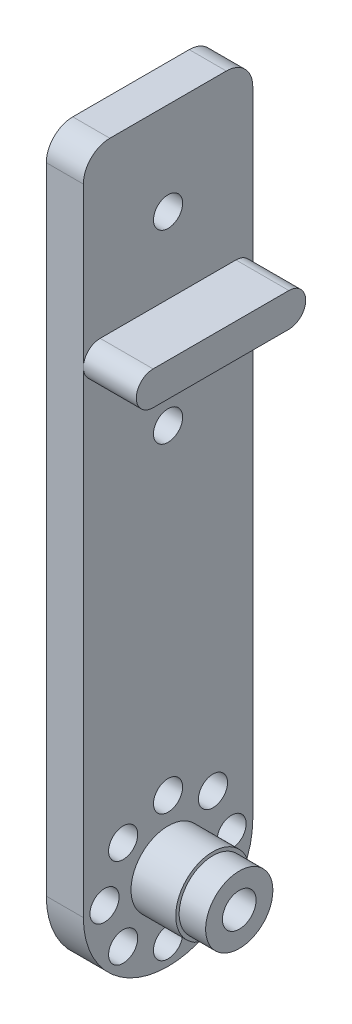
ISO-10303-21;
HEADER;
FILE_DESCRIPTION(('STEP AP214'),'2;1');
FILE_NAME('part.step','',(''),(''),'','','');
FILE_SCHEMA(('AUTOMOTIVE_DESIGN { 1 0 10303 214 1 1 1 1 }'));
ENDSEC;
DATA;
#1=APPLICATION_CONTEXT('core data for automotive mechanical design processes');
#2=APPLICATION_PROTOCOL_DEFINITION('international standard','automotive_design',2000,#1);
#3=PRODUCT_CONTEXT('',#1,'mechanical');
#4=PRODUCT('Part','Part','',(#3));
#5=PRODUCT_RELATED_PRODUCT_CATEGORY('part','',(#4));
#6=PRODUCT_DEFINITION_FORMATION('','',#4);
#7=PRODUCT_DEFINITION_CONTEXT('part definition',#1,'design');
#8=PRODUCT_DEFINITION('design','',#6,#7);
#9=PRODUCT_DEFINITION_SHAPE('','',#8);
#10=(LENGTH_UNIT() NAMED_UNIT(*) SI_UNIT(.MILLI.,.METRE.));
#11=(NAMED_UNIT(*) PLANE_ANGLE_UNIT() SI_UNIT($,.RADIAN.));
#12=(NAMED_UNIT(*) SI_UNIT($,.STERADIAN.) SOLID_ANGLE_UNIT());
#13=UNCERTAINTY_MEASURE_WITH_UNIT(LENGTH_MEASURE(1.E-05),#10,'distance_accuracy_value','');
#14=(GEOMETRIC_REPRESENTATION_CONTEXT(3) GLOBAL_UNCERTAINTY_ASSIGNED_CONTEXT((#13)) GLOBAL_UNIT_ASSIGNED_CONTEXT((#10,
#11,#12)) REPRESENTATION_CONTEXT('',''));
#15=CARTESIAN_POINT('',(0.,0.,0.));
#16=DIRECTION('',(0.,0.,1.));
#17=DIRECTION('',(1.,0.,0.));
#18=AXIS2_PLACEMENT_3D('',#15,#16,#17);
#19=CARTESIAN_POINT('',(7.,0.,0.));
#20=DIRECTION('',(1.,0.,0.));
#21=DIRECTION('',(0.,0.,-1.));
#22=AXIS2_PLACEMENT_3D('',#19,#20,#21);
#23=PLANE('',#22);
#24=CARTESIAN_POINT('',(7.,0.,0.));
#25=DIRECTION('',(1.,0.,0.));
#26=DIRECTION('',(0.,0.,-1.));
#27=AXIS2_PLACEMENT_3D('',#24,#25,#26);
#28=CIRCLE('',#27,7.);
#29=CARTESIAN_POINT('',(7.,0.,-7.));
#30=VERTEX_POINT('',#29);
#31=EDGE_CURVE('E277',#30,#30,#28,.T.);
#32=ORIENTED_EDGE('',*,*,#31,.F.);
#33=EDGE_LOOP('',(#32));
#34=FACE_BOUND('',#33,.T.);
#35=CARTESIAN_POINT('',(7.,0.,12.));
#36=DIRECTION('',(1.,0.,0.));
#37=DIRECTION('',(0.,0.,-1.));
#38=AXIS2_PLACEMENT_3D('',#35,#36,#37);
#39=CIRCLE('',#38,2.75);
#40=CARTESIAN_POINT('',(7.,0.,9.25));
#41=VERTEX_POINT('',#40);
#42=EDGE_CURVE('E291',#41,#41,#39,.T.);
#43=ORIENTED_EDGE('',*,*,#42,.F.);
#44=EDGE_LOOP('',(#43));
#45=FACE_BOUND('',#44,.T.);
#46=CARTESIAN_POINT('',(7.,-12.,0.));
#47=DIRECTION('',(1.,0.,0.));
#48=DIRECTION('',(0.,0.,-1.));
#49=AXIS2_PLACEMENT_3D('',#46,#47,#48);
#50=CIRCLE('',#49,2.75);
#51=CARTESIAN_POINT('',(7.,-12.,-2.75));
#52=VERTEX_POINT('',#51);
#53=EDGE_CURVE('E303',#52,#52,#50,.T.);
#54=ORIENTED_EDGE('',*,*,#53,.F.);
#55=EDGE_LOOP('',(#54));
#56=FACE_BOUND('',#55,.T.);
#57=CARTESIAN_POINT('',(7.,0.,-12.));
#58=DIRECTION('',(1.,0.,0.));
#59=DIRECTION('',(0.,0.,-1.));
#60=AXIS2_PLACEMENT_3D('',#57,#58,#59);
#61=CIRCLE('',#60,2.75);
#62=CARTESIAN_POINT('',(7.,0.,-14.75));
#63=VERTEX_POINT('',#62);
#64=EDGE_CURVE('E315',#63,#63,#61,.T.);
#65=ORIENTED_EDGE('',*,*,#64,.F.);
#66=EDGE_LOOP('',(#65));
#67=FACE_BOUND('',#66,.T.);
#68=CARTESIAN_POINT('',(7.,12.,0.));
#69=DIRECTION('',(1.,0.,0.));
#70=DIRECTION('',(0.,0.,-1.));
#71=AXIS2_PLACEMENT_3D('',#68,#69,#70);
#72=CIRCLE('',#71,2.75);
#73=CARTESIAN_POINT('',(7.,12.,-2.75));
#74=VERTEX_POINT('',#73);
#75=EDGE_CURVE('E327',#74,#74,#72,.T.);
#76=ORIENTED_EDGE('',*,*,#75,.F.);
#77=EDGE_LOOP('',(#76));
#78=FACE_BOUND('',#77,.T.);
#79=CARTESIAN_POINT('',(7.,72.5,0.));
#80=DIRECTION('',(1.,0.,0.));
#81=DIRECTION('',(0.,0.,-1.));
#82=AXIS2_PLACEMENT_3D('',#79,#80,#81);
#83=CIRCLE('',#82,2.75);
#84=CARTESIAN_POINT('',(7.,72.5,-2.75));
#85=VERTEX_POINT('',#84);
#86=EDGE_CURVE('E198',#85,#85,#83,.T.);
#87=ORIENTED_EDGE('',*,*,#86,.F.);
#88=EDGE_LOOP('',(#87));
#89=FACE_BOUND('',#88,.T.);
#90=CARTESIAN_POINT('',(7.,8.48528137423857,-8.48528137423857));
#91=DIRECTION('',(1.,0.,0.));
#92=DIRECTION('',(0.,0.,-1.));
#93=AXIS2_PLACEMENT_3D('',#90,#91,#92);
#94=CIRCLE('',#93,2.75);
#95=CARTESIAN_POINT('',(7.,8.48528137423857,-11.2352813742386));
#96=VERTEX_POINT('',#95);
#97=EDGE_CURVE('E321',#96,#96,#94,.T.);
#98=ORIENTED_EDGE('',*,*,#97,.F.);
#99=EDGE_LOOP('',(#98));
#100=FACE_BOUND('',#99,.T.);
#101=CARTESIAN_POINT('',(7.,-8.48528137423857,-8.48528137423857));
#102=DIRECTION('',(1.,0.,0.));
#103=DIRECTION('',(0.,0.,-1.));
#104=AXIS2_PLACEMENT_3D('',#101,#102,#103);
#105=CIRCLE('',#104,2.75);
#106=CARTESIAN_POINT('',(7.,-8.48528137423857,-11.2352813742386));
#107=VERTEX_POINT('',#106);
#108=EDGE_CURVE('E309',#107,#107,#105,.T.);
#109=ORIENTED_EDGE('',*,*,#108,.F.);
#110=EDGE_LOOP('',(#109));
#111=FACE_BOUND('',#110,.T.);
#112=CARTESIAN_POINT('',(7.,-8.48528137423857,8.48528137423857));
#113=DIRECTION('',(1.,0.,0.));
#114=DIRECTION('',(0.,0.,-1.));
#115=AXIS2_PLACEMENT_3D('',#112,#113,#114);
#116=CIRCLE('',#115,2.75);
#117=CARTESIAN_POINT('',(7.,-8.48528137423857,5.73528137423857));
#118=VERTEX_POINT('',#117);
#119=EDGE_CURVE('E297',#118,#118,#116,.T.);
#120=ORIENTED_EDGE('',*,*,#119,.F.);
#121=EDGE_LOOP('',(#120));
#122=FACE_BOUND('',#121,.T.);
#123=CARTESIAN_POINT('',(7.,8.48528137423857,8.48528137423857));
#124=DIRECTION('',(1.,0.,0.));
#125=DIRECTION('',(0.,0.,-1.));
#126=AXIS2_PLACEMENT_3D('',#123,#124,#125);
#127=CIRCLE('',#126,2.75);
#128=CARTESIAN_POINT('',(7.,8.48528137423857,5.73528137423857));
#129=VERTEX_POINT('',#128);
#130=EDGE_CURVE('E285',#129,#129,#127,.T.);
#131=ORIENTED_EDGE('',*,*,#130,.F.);
#132=EDGE_LOOP('',(#131));
#133=FACE_BOUND('',#132,.T.);
#134=CARTESIAN_POINT('',(7.,90.,-12.825));
#135=DIRECTION('',(1.,0.,0.));
#136=DIRECTION('',(0.,0.,-1.));
#137=AXIS2_PLACEMENT_3D('',#134,#135,#136);
#138=CIRCLE('',#137,3.17500000000001);
#139=CARTESIAN_POINT('',(7.,86.825,-12.825));
#140=VERTEX_POINT('',#139);
#141=CARTESIAN_POINT('',(7.,90.,-16.));
#142=VERTEX_POINT('',#141);
#143=EDGE_CURVE('E584',#140,#142,#138,.T.);
#144=ORIENTED_EDGE('',*,*,#143,.F.);
#145=DIRECTION('',(0.,0.,-1.));
#146=VECTOR('',#145,1.);
#147=CARTESIAN_POINT('',(7.,86.825,12.825));
#148=LINE('',#147,#146);
#149=CARTESIAN_POINT('',(7.,86.825,12.825));
#150=VERTEX_POINT('',#149);
#151=EDGE_CURVE('E585',#150,#140,#148,.T.);
#152=ORIENTED_EDGE('',*,*,#151,.F.);
#153=CARTESIAN_POINT('',(7.,90.,12.825));
#154=DIRECTION('',(1.,0.,0.));
#155=DIRECTION('',(0.,0.,-1.));
#156=AXIS2_PLACEMENT_3D('',#153,#154,#155);
#157=CIRCLE('',#156,3.17500000000001);
#158=CARTESIAN_POINT('',(7.,90.,16.));
#159=VERTEX_POINT('',#158);
#160=EDGE_CURVE('E267',#159,#150,#157,.T.);
#161=ORIENTED_EDGE('',*,*,#160,.F.);
#162=DIRECTION('',(0.,-1.,0.));
#163=VECTOR('',#162,1.);
#164=CARTESIAN_POINT('',(7.,119.999999999996,16.));
#165=LINE('',#164,#163);
#166=CARTESIAN_POINT('',(7.,0.,16.));
#167=VERTEX_POINT('',#166);
#168=EDGE_CURVE('E63',#159,#167,#165,.T.);
#169=ORIENTED_EDGE('',*,*,#168,.T.);
#170=CARTESIAN_POINT('',(7.,0.,0.));
#171=DIRECTION('',(1.,0.,0.));
#172=DIRECTION('',(0.,0.,-1.));
#173=AXIS2_PLACEMENT_3D('',#170,#171,#172);
#174=CIRCLE('',#173,16.);
#175=CARTESIAN_POINT('',(7.,0.,-16.));
#176=VERTEX_POINT('',#175);
#177=EDGE_CURVE('E154',#167,#176,#174,.T.);
#178=ORIENTED_EDGE('',*,*,#177,.T.);
#179=DIRECTION('',(0.,1.,0.));
#180=VECTOR('',#179,1.);
#181=CARTESIAN_POINT('',(7.,119.999999999996,-16.));
#182=LINE('',#181,#180);
#183=EDGE_CURVE('E100',#176,#142,#182,.T.);
#184=ORIENTED_EDGE('',*,*,#183,.T.);
#185=EDGE_LOOP('',(#144,#152,#161,#169,#178,#184));
#186=FACE_BOUND('',#185,.T.);
#187=ADVANCED_FACE('F38',(#34,#45,#56,#67,#78,#89,#100,#111,#122,#133,#186),#23,.T.);
#188=CARTESIAN_POINT('',(7.,107.5,0.));
#189=DIRECTION('',(1.,0.,0.));
#190=DIRECTION('',(0.,0.,-1.));
#191=AXIS2_PLACEMENT_3D('',#188,#189,#190);
#192=CIRCLE('',#191,2.7499945);
#193=CARTESIAN_POINT('',(7.,107.5,-2.7499945));
#194=VERTEX_POINT('',#193);
#195=EDGE_CURVE('E146',#194,#194,#192,.T.);
#196=ORIENTED_EDGE('',*,*,#195,.F.);
#197=EDGE_LOOP('',(#196));
#198=FACE_BOUND('',#197,.T.);
#199=CARTESIAN_POINT('',(7.,119.999999999996,16.));
#200=VERTEX_POINT('',#199);
#201=EDGE_CURVE('E137',#200,#159,#165,.T.);
#202=ORIENTED_EDGE('',*,*,#201,.T.);
#203=CARTESIAN_POINT('',(7.,93.175,12.825));
#204=VERTEX_POINT('',#203);
#205=EDGE_CURVE('E222',#204,#159,#157,.T.);
#206=ORIENTED_EDGE('',*,*,#205,.F.);
#207=DIRECTION('',(0.,0.,1.));
#208=VECTOR('',#207,1.);
#209=CARTESIAN_POINT('',(7.,93.175,12.825));
#210=LINE('',#209,#208);
#211=CARTESIAN_POINT('',(7.,93.175,-12.825));
#212=VERTEX_POINT('',#211);
#213=EDGE_CURVE('E265',#212,#204,#210,.T.);
#214=ORIENTED_EDGE('',*,*,#213,.F.);
#215=EDGE_CURVE('E210',#142,#212,#138,.T.);
#216=ORIENTED_EDGE('',*,*,#215,.F.);
#217=CARTESIAN_POINT('',(7.,119.999999999996,-16.));
#218=VERTEX_POINT('',#217);
#219=EDGE_CURVE('E205',#142,#218,#182,.T.);
#220=ORIENTED_EDGE('',*,*,#219,.T.);
#221=CARTESIAN_POINT('',(7.,120.,-11.));
#222=DIRECTION('',(1.,0.,0.));
#223=DIRECTION('',(0.,0.,-1.));
#224=AXIS2_PLACEMENT_3D('',#221,#222,#223);
#225=CIRCLE('',#224,5.);
#226=CARTESIAN_POINT('',(7.,125.,-11.));
#227=VERTEX_POINT('',#226);
#228=EDGE_CURVE('E119',#218,#227,#225,.T.);
#229=ORIENTED_EDGE('',*,*,#228,.T.);
#230=DIRECTION('',(0.,0.,1.));
#231=VECTOR('',#230,1.);
#232=CARTESIAN_POINT('',(7.,125.,11.));
#233=LINE('',#232,#231);
#234=CARTESIAN_POINT('',(7.,125.,11.));
#235=VERTEX_POINT('',#234);
#236=EDGE_CURVE('E111',#227,#235,#233,.T.);
#237=ORIENTED_EDGE('',*,*,#236,.T.);
#238=CARTESIAN_POINT('',(7.,120.,11.));
#239=DIRECTION('',(1.,0.,0.));
#240=DIRECTION('',(0.,0.,1.));
#241=AXIS2_PLACEMENT_3D('',#238,#239,#240);
#242=CIRCLE('',#241,5.);
#243=EDGE_CURVE('E116',#235,#200,#242,.T.);
#244=ORIENTED_EDGE('',*,*,#243,.T.);
#245=EDGE_LOOP('',(#202,#206,#214,#216,#220,#229,#237,#244));
#246=FACE_BOUND('',#245,.T.);
#247=ADVANCED_FACE('F114',(#198,#246),#23,.T.);
#248=CARTESIAN_POINT('',(0.,0.,0.));
#249=DIRECTION('',(1.,0.,0.));
#250=DIRECTION('',(0.,0.,-1.));
#251=AXIS2_PLACEMENT_3D('',#248,#249,#250);
#252=PLANE('',#251);
#253=CARTESIAN_POINT('',(0.,0.,0.));
#254=DIRECTION('',(1.,0.,0.));
#255=DIRECTION('',(0.,0.,-1.));
#256=AXIS2_PLACEMENT_3D('',#253,#254,#255);
#257=CIRCLE('',#256,16.);
#258=CARTESIAN_POINT('',(0.,0.,16.));
#259=VERTEX_POINT('',#258);
#260=CARTESIAN_POINT('',(0.,0.,-16.));
#261=VERTEX_POINT('',#260);
#262=EDGE_CURVE('E142',#259,#261,#257,.T.);
#263=ORIENTED_EDGE('',*,*,#262,.F.);
#264=DIRECTION('',(0.,-1.,0.));
#265=VECTOR('',#264,1.);
#266=CARTESIAN_POINT('',(0.,119.999999999996,16.));
#267=LINE('',#266,#265);
#268=CARTESIAN_POINT('',(0.,119.999999999996,16.));
#269=VERTEX_POINT('',#268);
#270=EDGE_CURVE('E91',#269,#259,#267,.T.);
#271=ORIENTED_EDGE('',*,*,#270,.F.);
#272=CARTESIAN_POINT('',(0.,120.,11.));
#273=DIRECTION('',(1.,0.,0.));
#274=DIRECTION('',(0.,0.,1.));
#275=AXIS2_PLACEMENT_3D('',#272,#273,#274);
#276=CIRCLE('',#275,5.);
#277=CARTESIAN_POINT('',(0.,125.,11.));
#278=VERTEX_POINT('',#277);
#279=EDGE_CURVE('E151',#278,#269,#276,.T.);
#280=ORIENTED_EDGE('',*,*,#279,.F.);
#281=DIRECTION('',(0.,0.,1.));
#282=VECTOR('',#281,1.);
#283=CARTESIAN_POINT('',(0.,125.,11.));
#284=LINE('',#283,#282);
#285=CARTESIAN_POINT('',(0.,125.,-11.));
#286=VERTEX_POINT('',#285);
#287=EDGE_CURVE('E128',#286,#278,#284,.T.);
#288=ORIENTED_EDGE('',*,*,#287,.F.);
#289=CARTESIAN_POINT('',(0.,120.,-11.));
#290=DIRECTION('',(1.,0.,0.));
#291=DIRECTION('',(0.,0.,-1.));
#292=AXIS2_PLACEMENT_3D('',#289,#290,#291);
#293=CIRCLE('',#292,5.);
#294=CARTESIAN_POINT('',(0.,119.999999999996,-16.));
#295=VERTEX_POINT('',#294);
#296=EDGE_CURVE('E148',#295,#286,#293,.T.);
#297=ORIENTED_EDGE('',*,*,#296,.F.);
#298=DIRECTION('',(0.,1.,0.));
#299=VECTOR('',#298,1.);
#300=CARTESIAN_POINT('',(0.,119.999999999996,-16.));
#301=LINE('',#300,#299);
#302=EDGE_CURVE('E145',#261,#295,#301,.T.);
#303=ORIENTED_EDGE('',*,*,#302,.F.);
#304=EDGE_LOOP('',(#263,#271,#280,#288,#297,#303));
#305=FACE_BOUND('',#304,.T.);
#306=CARTESIAN_POINT('',(0.,107.5,0.));
#307=DIRECTION('',(1.,0.,0.));
#308=DIRECTION('',(0.,0.,-1.));
#309=AXIS2_PLACEMENT_3D('',#306,#307,#308);
#310=CIRCLE('',#309,2.7499945);
#311=CARTESIAN_POINT('',(0.,107.5,-2.7499945));
#312=VERTEX_POINT('',#311);
#313=EDGE_CURVE('E195',#312,#312,#310,.T.);
#314=ORIENTED_EDGE('',*,*,#313,.T.);
#315=EDGE_LOOP('',(#314));
#316=FACE_BOUND('',#315,.T.);
#317=CARTESIAN_POINT('',(0.,72.5,0.));
#318=DIRECTION('',(1.,0.,0.));
#319=DIRECTION('',(0.,0.,-1.));
#320=AXIS2_PLACEMENT_3D('',#317,#318,#319);
#321=CIRCLE('',#320,2.75);
#322=CARTESIAN_POINT('',(0.,72.5,-2.75));
#323=VERTEX_POINT('',#322);
#324=EDGE_CURVE('E201',#323,#323,#321,.T.);
#325=ORIENTED_EDGE('',*,*,#324,.T.);
#326=EDGE_LOOP('',(#325));
#327=FACE_BOUND('',#326,.T.);
#328=CARTESIAN_POINT('',(0.,12.,0.));
#329=DIRECTION('',(1.,0.,0.));
#330=DIRECTION('',(0.,0.,-1.));
#331=AXIS2_PLACEMENT_3D('',#328,#329,#330);
#332=CIRCLE('',#331,2.75);
#333=CARTESIAN_POINT('',(0.,12.,-2.75));
#334=VERTEX_POINT('',#333);
#335=EDGE_CURVE('E324',#334,#334,#332,.T.);
#336=ORIENTED_EDGE('',*,*,#335,.T.);
#337=EDGE_LOOP('',(#336));
#338=FACE_BOUND('',#337,.T.);
#339=CARTESIAN_POINT('',(0.,8.48528137423857,-8.48528137423857));
#340=DIRECTION('',(1.,0.,0.));
#341=DIRECTION('',(0.,0.,-1.));
#342=AXIS2_PLACEMENT_3D('',#339,#340,#341);
#343=CIRCLE('',#342,2.75);
#344=CARTESIAN_POINT('',(0.,8.48528137423857,-11.2352813742386));
#345=VERTEX_POINT('',#344);
#346=EDGE_CURVE('E318',#345,#345,#343,.T.);
#347=ORIENTED_EDGE('',*,*,#346,.T.);
#348=EDGE_LOOP('',(#347));
#349=FACE_BOUND('',#348,.T.);
#350=CARTESIAN_POINT('',(0.,0.,-12.));
#351=DIRECTION('',(1.,0.,0.));
#352=DIRECTION('',(0.,0.,-1.));
#353=AXIS2_PLACEMENT_3D('',#350,#351,#352);
#354=CIRCLE('',#353,2.75);
#355=CARTESIAN_POINT('',(0.,0.,-14.75));
#356=VERTEX_POINT('',#355);
#357=EDGE_CURVE('E312',#356,#356,#354,.T.);
#358=ORIENTED_EDGE('',*,*,#357,.T.);
#359=EDGE_LOOP('',(#358));
#360=FACE_BOUND('',#359,.T.);
#361=CARTESIAN_POINT('',(0.,-8.48528137423857,-8.48528137423857));
#362=DIRECTION('',(1.,0.,0.));
#363=DIRECTION('',(0.,0.,-1.));
#364=AXIS2_PLACEMENT_3D('',#361,#362,#363);
#365=CIRCLE('',#364,2.75);
#366=CARTESIAN_POINT('',(0.,-8.48528137423857,-11.2352813742386));
#367=VERTEX_POINT('',#366);
#368=EDGE_CURVE('E306',#367,#367,#365,.T.);
#369=ORIENTED_EDGE('',*,*,#368,.T.);
#370=EDGE_LOOP('',(#369));
#371=FACE_BOUND('',#370,.T.);
#372=CARTESIAN_POINT('',(0.,-12.,0.));
#373=DIRECTION('',(1.,0.,0.));
#374=DIRECTION('',(0.,0.,-1.));
#375=AXIS2_PLACEMENT_3D('',#372,#373,#374);
#376=CIRCLE('',#375,2.75);
#377=CARTESIAN_POINT('',(0.,-12.,-2.75));
#378=VERTEX_POINT('',#377);
#379=EDGE_CURVE('E300',#378,#378,#376,.T.);
#380=ORIENTED_EDGE('',*,*,#379,.T.);
#381=EDGE_LOOP('',(#380));
#382=FACE_BOUND('',#381,.T.);
#383=CARTESIAN_POINT('',(0.,-8.48528137423857,8.48528137423857));
#384=DIRECTION('',(1.,0.,0.));
#385=DIRECTION('',(0.,0.,-1.));
#386=AXIS2_PLACEMENT_3D('',#383,#384,#385);
#387=CIRCLE('',#386,2.75);
#388=CARTESIAN_POINT('',(0.,-8.48528137423857,5.73528137423857));
#389=VERTEX_POINT('',#388);
#390=EDGE_CURVE('E294',#389,#389,#387,.T.);
#391=ORIENTED_EDGE('',*,*,#390,.T.);
#392=EDGE_LOOP('',(#391));
#393=FACE_BOUND('',#392,.T.);
#394=CARTESIAN_POINT('',(0.,0.,12.));
#395=DIRECTION('',(1.,0.,0.));
#396=DIRECTION('',(0.,0.,-1.));
#397=AXIS2_PLACEMENT_3D('',#394,#395,#396);
#398=CIRCLE('',#397,2.75);
#399=CARTESIAN_POINT('',(0.,0.,9.25));
#400=VERTEX_POINT('',#399);
#401=EDGE_CURVE('E288',#400,#400,#398,.T.);
#402=ORIENTED_EDGE('',*,*,#401,.T.);
#403=EDGE_LOOP('',(#402));
#404=FACE_BOUND('',#403,.T.);
#405=CARTESIAN_POINT('',(0.,8.48528137423857,8.48528137423857));
#406=DIRECTION('',(1.,0.,0.));
#407=DIRECTION('',(0.,0.,-1.));
#408=AXIS2_PLACEMENT_3D('',#405,#406,#407);
#409=CIRCLE('',#408,2.75);
#410=CARTESIAN_POINT('',(0.,8.48528137423857,5.73528137423857));
#411=VERTEX_POINT('',#410);
#412=EDGE_CURVE('E282',#411,#411,#409,.T.);
#413=ORIENTED_EDGE('',*,*,#412,.T.);
#414=EDGE_LOOP('',(#413));
#415=FACE_BOUND('',#414,.T.);
#416=ADVANCED_FACE('F186',(#305,#316,#327,#338,#349,#360,#371,#382,#393,#404,#415),#252,.F.);
#417=CARTESIAN_POINT('',(7.,0.,0.));
#418=DIRECTION('',(-1.,0.,0.));
#419=DIRECTION('',(0.,0.,1.));
#420=AXIS2_PLACEMENT_3D('',#417,#418,#419);
#421=CYLINDRICAL_SURFACE('',#420,16.);
#422=ORIENTED_EDGE('',*,*,#262,.T.);
#423=DIRECTION('',(-1.,0.,0.));
#424=VECTOR('',#423,1.);
#425=CARTESIAN_POINT('',(7.,0.,-16.));
#426=LINE('',#425,#424);
#427=EDGE_CURVE('E160',#176,#261,#426,.T.);
#428=ORIENTED_EDGE('',*,*,#427,.F.);
#429=ORIENTED_EDGE('',*,*,#177,.F.);
#430=DIRECTION('',(-1.,0.,0.));
#431=VECTOR('',#430,1.);
#432=CARTESIAN_POINT('',(7.,0.,16.));
#433=LINE('',#432,#431);
#434=EDGE_CURVE('E141',#167,#259,#433,.T.);
#435=ORIENTED_EDGE('',*,*,#434,.T.);
#436=EDGE_LOOP('',(#422,#428,#429,#435));
#437=FACE_BOUND('',#436,.T.);
#438=ADVANCED_FACE('F40',(#437),#421,.T.);
#439=CARTESIAN_POINT('',(7.,119.999999999996,-16.));
#440=DIRECTION('',(0.,0.,1.));
#441=DIRECTION('',(1.,0.,0.));
#442=AXIS2_PLACEMENT_3D('',#439,#440,#441);
#443=PLANE('',#442);
#444=ORIENTED_EDGE('',*,*,#302,.T.);
#445=DIRECTION('',(-1.,0.,0.));
#446=VECTOR('',#445,1.);
#447=CARTESIAN_POINT('',(7.,119.999999999996,-16.));
#448=LINE('',#447,#446);
#449=EDGE_CURVE('E158',#218,#295,#448,.T.);
#450=ORIENTED_EDGE('',*,*,#449,.F.);
#451=ORIENTED_EDGE('',*,*,#219,.F.);
#452=ORIENTED_EDGE('',*,*,#183,.F.);
#453=ORIENTED_EDGE('',*,*,#427,.T.);
#454=EDGE_LOOP('',(#444,#450,#451,#452,#453));
#455=FACE_BOUND('',#454,.T.);
#456=ADVANCED_FACE('F211',(#455),#443,.F.);
#457=CARTESIAN_POINT('',(7.,120.,-11.));
#458=DIRECTION('',(-1.,0.,0.));
#459=DIRECTION('',(0.,0.,1.));
#460=AXIS2_PLACEMENT_3D('',#457,#458,#459);
#461=CYLINDRICAL_SURFACE('',#460,5.);
#462=ORIENTED_EDGE('',*,*,#296,.T.);
#463=DIRECTION('',(-1.,0.,0.));
#464=VECTOR('',#463,1.);
#465=CARTESIAN_POINT('',(7.,125.,-11.));
#466=LINE('',#465,#464);
#467=EDGE_CURVE('E131',#227,#286,#466,.T.);
#468=ORIENTED_EDGE('',*,*,#467,.F.);
#469=ORIENTED_EDGE('',*,*,#228,.F.);
#470=ORIENTED_EDGE('',*,*,#449,.T.);
#471=EDGE_LOOP('',(#462,#468,#469,#470));
#472=FACE_BOUND('',#471,.T.);
#473=ADVANCED_FACE('F214',(#472),#461,.T.);
#474=CARTESIAN_POINT('',(7.,125.,11.));
#475=DIRECTION('',(0.,-1.,0.));
#476=DIRECTION('',(0.,0.,-1.));
#477=AXIS2_PLACEMENT_3D('',#474,#475,#476);
#478=PLANE('',#477);
#479=ORIENTED_EDGE('',*,*,#287,.T.);
#480=DIRECTION('',(-1.,0.,0.));
#481=VECTOR('',#480,1.);
#482=CARTESIAN_POINT('',(7.,125.,11.));
#483=LINE('',#482,#481);
#484=EDGE_CURVE('E125',#235,#278,#483,.T.);
#485=ORIENTED_EDGE('',*,*,#484,.F.);
#486=ORIENTED_EDGE('',*,*,#236,.F.);
#487=ORIENTED_EDGE('',*,*,#467,.T.);
#488=EDGE_LOOP('',(#479,#485,#486,#487));
#489=FACE_BOUND('',#488,.T.);
#490=ADVANCED_FACE('F126',(#489),#478,.F.);
#491=CARTESIAN_POINT('',(7.,120.,11.));
#492=DIRECTION('',(-1.,0.,0.));
#493=DIRECTION('',(0.,0.,1.));
#494=AXIS2_PLACEMENT_3D('',#491,#492,#493);
#495=CYLINDRICAL_SURFACE('',#494,5.);
#496=ORIENTED_EDGE('',*,*,#279,.T.);
#497=DIRECTION('',(-1.,0.,0.));
#498=VECTOR('',#497,1.);
#499=CARTESIAN_POINT('',(7.,119.999999999996,16.));
#500=LINE('',#499,#498);
#501=EDGE_CURVE('E132',#200,#269,#500,.T.);
#502=ORIENTED_EDGE('',*,*,#501,.F.);
#503=ORIENTED_EDGE('',*,*,#243,.F.);
#504=ORIENTED_EDGE('',*,*,#484,.T.);
#505=EDGE_LOOP('',(#496,#502,#503,#504));
#506=FACE_BOUND('',#505,.T.);
#507=ADVANCED_FACE('F134',(#506),#495,.T.);
#508=CARTESIAN_POINT('',(7.,119.999999999996,16.));
#509=DIRECTION('',(0.,0.,-1.));
#510=DIRECTION('',(-1.,0.,0.));
#511=AXIS2_PLACEMENT_3D('',#508,#509,#510);
#512=PLANE('',#511);
#513=ORIENTED_EDGE('',*,*,#270,.T.);
#514=ORIENTED_EDGE('',*,*,#434,.F.);
#515=ORIENTED_EDGE('',*,*,#168,.F.);
#516=ORIENTED_EDGE('',*,*,#201,.F.);
#517=ORIENTED_EDGE('',*,*,#501,.T.);
#518=EDGE_LOOP('',(#513,#514,#515,#516,#517));
#519=FACE_BOUND('',#518,.T.);
#520=ADVANCED_FACE('F217',(#519),#512,.F.);
#521=CARTESIAN_POINT('',(7.,107.5,0.));
#522=DIRECTION('',(-1.,0.,0.));
#523=DIRECTION('',(0.,0.,1.));
#524=AXIS2_PLACEMENT_3D('',#521,#522,#523);
#525=CYLINDRICAL_SURFACE('',#524,2.7499945);
#526=ORIENTED_EDGE('',*,*,#195,.T.);
#527=EDGE_LOOP('',(#526));
#528=FACE_BOUND('',#527,.T.);
#529=ORIENTED_EDGE('',*,*,#313,.F.);
#530=EDGE_LOOP('',(#529));
#531=FACE_BOUND('',#530,.T.);
#532=ADVANCED_FACE('F342',(#528,#531),#525,.F.);
#533=CARTESIAN_POINT('',(7.,72.5,0.));
#534=DIRECTION('',(-1.,0.,0.));
#535=DIRECTION('',(0.,0.,1.));
#536=AXIS2_PLACEMENT_3D('',#533,#534,#535);
#537=CYLINDRICAL_SURFACE('',#536,2.75);
#538=ORIENTED_EDGE('',*,*,#86,.T.);
#539=EDGE_LOOP('',(#538));
#540=FACE_BOUND('',#539,.T.);
#541=ORIENTED_EDGE('',*,*,#324,.F.);
#542=EDGE_LOOP('',(#541));
#543=FACE_BOUND('',#542,.T.);
#544=ADVANCED_FACE('F339',(#540,#543),#537,.F.);
#545=CARTESIAN_POINT('',(7.,12.,0.));
#546=DIRECTION('',(-1.,0.,0.));
#547=DIRECTION('',(0.,0.,1.));
#548=AXIS2_PLACEMENT_3D('',#545,#546,#547);
#549=CYLINDRICAL_SURFACE('',#548,2.75);
#550=ORIENTED_EDGE('',*,*,#75,.T.);
#551=EDGE_LOOP('',(#550));
#552=FACE_BOUND('',#551,.T.);
#553=ORIENTED_EDGE('',*,*,#335,.F.);
#554=EDGE_LOOP('',(#553));
#555=FACE_BOUND('',#554,.T.);
#556=ADVANCED_FACE('F341',(#552,#555),#549,.F.);
#557=CARTESIAN_POINT('',(7.,8.48528137423857,-8.48528137423857));
#558=DIRECTION('',(-1.,0.,0.));
#559=DIRECTION('',(0.,0.,1.));
#560=AXIS2_PLACEMENT_3D('',#557,#558,#559);
#561=CYLINDRICAL_SURFACE('',#560,2.75);
#562=ORIENTED_EDGE('',*,*,#97,.T.);
#563=EDGE_LOOP('',(#562));
#564=FACE_BOUND('',#563,.T.);
#565=ORIENTED_EDGE('',*,*,#346,.F.);
#566=EDGE_LOOP('',(#565));
#567=FACE_BOUND('',#566,.T.);
#568=ADVANCED_FACE('F348',(#564,#567),#561,.F.);
#569=CARTESIAN_POINT('',(7.,0.,-12.));
#570=DIRECTION('',(-1.,0.,0.));
#571=DIRECTION('',(0.,0.,1.));
#572=AXIS2_PLACEMENT_3D('',#569,#570,#571);
#573=CYLINDRICAL_SURFACE('',#572,2.75);
#574=ORIENTED_EDGE('',*,*,#64,.T.);
#575=EDGE_LOOP('',(#574));
#576=FACE_BOUND('',#575,.T.);
#577=ORIENTED_EDGE('',*,*,#357,.F.);
#578=EDGE_LOOP('',(#577));
#579=FACE_BOUND('',#578,.T.);
#580=ADVANCED_FACE('F354',(#576,#579),#573,.F.);
#581=CARTESIAN_POINT('',(7.,-8.48528137423857,-8.48528137423857));
#582=DIRECTION('',(-1.,0.,0.));
#583=DIRECTION('',(0.,0.,1.));
#584=AXIS2_PLACEMENT_3D('',#581,#582,#583);
#585=CYLINDRICAL_SURFACE('',#584,2.75);
#586=ORIENTED_EDGE('',*,*,#108,.T.);
#587=EDGE_LOOP('',(#586));
#588=FACE_BOUND('',#587,.T.);
#589=ORIENTED_EDGE('',*,*,#368,.F.);
#590=EDGE_LOOP('',(#589));
#591=FACE_BOUND('',#590,.T.);
#592=ADVANCED_FACE('F358',(#588,#591),#585,.F.);
#593=CARTESIAN_POINT('',(7.,-12.,0.));
#594=DIRECTION('',(-1.,0.,0.));
#595=DIRECTION('',(0.,0.,1.));
#596=AXIS2_PLACEMENT_3D('',#593,#594,#595);
#597=CYLINDRICAL_SURFACE('',#596,2.75);
#598=ORIENTED_EDGE('',*,*,#53,.T.);
#599=EDGE_LOOP('',(#598));
#600=FACE_BOUND('',#599,.T.);
#601=ORIENTED_EDGE('',*,*,#379,.F.);
#602=EDGE_LOOP('',(#601));
#603=FACE_BOUND('',#602,.T.);
#604=ADVANCED_FACE('F362',(#600,#603),#597,.F.);
#605=CARTESIAN_POINT('',(7.,-8.48528137423857,8.48528137423857));
#606=DIRECTION('',(-1.,0.,0.));
#607=DIRECTION('',(0.,0.,1.));
#608=AXIS2_PLACEMENT_3D('',#605,#606,#607);
#609=CYLINDRICAL_SURFACE('',#608,2.75);
#610=ORIENTED_EDGE('',*,*,#119,.T.);
#611=EDGE_LOOP('',(#610));
#612=FACE_BOUND('',#611,.T.);
#613=ORIENTED_EDGE('',*,*,#390,.F.);
#614=EDGE_LOOP('',(#613));
#615=FACE_BOUND('',#614,.T.);
#616=ADVANCED_FACE('F366',(#612,#615),#609,.F.);
#617=CARTESIAN_POINT('',(7.,0.,12.));
#618=DIRECTION('',(-1.,0.,0.));
#619=DIRECTION('',(0.,0.,1.));
#620=AXIS2_PLACEMENT_3D('',#617,#618,#619);
#621=CYLINDRICAL_SURFACE('',#620,2.75);
#622=ORIENTED_EDGE('',*,*,#42,.T.);
#623=EDGE_LOOP('',(#622));
#624=FACE_BOUND('',#623,.T.);
#625=ORIENTED_EDGE('',*,*,#401,.F.);
#626=EDGE_LOOP('',(#625));
#627=FACE_BOUND('',#626,.T.);
#628=ADVANCED_FACE('F370',(#624,#627),#621,.F.);
#629=CARTESIAN_POINT('',(7.,8.48528137423857,8.48528137423857));
#630=DIRECTION('',(-1.,0.,0.));
#631=DIRECTION('',(0.,0.,1.));
#632=AXIS2_PLACEMENT_3D('',#629,#630,#631);
#633=CYLINDRICAL_SURFACE('',#632,2.75);
#634=ORIENTED_EDGE('',*,*,#130,.T.);
#635=EDGE_LOOP('',(#634));
#636=FACE_BOUND('',#635,.T.);
#637=ORIENTED_EDGE('',*,*,#412,.F.);
#638=EDGE_LOOP('',(#637));
#639=FACE_BOUND('',#638,.T.);
#640=ADVANCED_FACE('F374',(#636,#639),#633,.F.);
#641=CARTESIAN_POINT('',(15.449,0.,0.));
#642=DIRECTION('',(1.,0.,0.));
#643=DIRECTION('',(0.,0.,-1.));
#644=AXIS2_PLACEMENT_3D('',#641,#642,#643);
#645=PLANE('',#644);
#646=CARTESIAN_POINT('',(15.449,0.,0.));
#647=DIRECTION('',(1.,0.,0.));
#648=DIRECTION('',(0.,0.,-1.));
#649=AXIS2_PLACEMENT_3D('',#646,#647,#648);
#650=CIRCLE('',#649,6.35);
#651=CARTESIAN_POINT('',(15.449,0.,-6.35));
#652=VERTEX_POINT('',#651);
#653=EDGE_CURVE('E11',#652,#652,#650,.T.);
#654=ORIENTED_EDGE('',*,*,#653,.F.);
#655=EDGE_LOOP('',(#654));
#656=FACE_BOUND('',#655,.T.);
#657=CARTESIAN_POINT('',(15.449,0.,0.));
#658=DIRECTION('',(1.,0.,0.));
#659=DIRECTION('',(0.,0.,-1.));
#660=AXIS2_PLACEMENT_3D('',#657,#658,#659);
#661=CIRCLE('',#660,7.);
#662=CARTESIAN_POINT('',(15.449,0.,-7.));
#663=VERTEX_POINT('',#662);
#664=EDGE_CURVE('E279',#663,#663,#661,.T.);
#665=ORIENTED_EDGE('',*,*,#664,.T.);
#666=EDGE_LOOP('',(#665));
#667=FACE_BOUND('',#666,.T.);
#668=ADVANCED_FACE('F378',(#656,#667),#645,.T.);
#669=CARTESIAN_POINT('',(15.449,0.,0.));
#670=DIRECTION('',(-1.,0.,0.));
#671=DIRECTION('',(0.,0.,1.));
#672=AXIS2_PLACEMENT_3D('',#669,#670,#671);
#673=CYLINDRICAL_SURFACE('',#672,7.);
#674=ORIENTED_EDGE('',*,*,#664,.F.);
#675=EDGE_LOOP('',(#674));
#676=FACE_BOUND('',#675,.T.);
#677=ORIENTED_EDGE('',*,*,#31,.T.);
#678=EDGE_LOOP('',(#677));
#679=FACE_BOUND('',#678,.T.);
#680=ADVANCED_FACE('F380',(#676,#679),#673,.T.);
#681=CARTESIAN_POINT('',(20.449,0.,0.));
#682=DIRECTION('',(-1.,0.,0.));
#683=DIRECTION('',(0.,0.,1.));
#684=AXIS2_PLACEMENT_3D('',#681,#682,#683);
#685=CYLINDRICAL_SURFACE('',#684,6.35);
#686=CARTESIAN_POINT('',(20.449,0.,0.));
#687=DIRECTION('',(1.,0.,0.));
#688=DIRECTION('',(0.,0.,-1.));
#689=AXIS2_PLACEMENT_3D('',#686,#687,#688);
#690=CIRCLE('',#689,6.35);
#691=CARTESIAN_POINT('',(20.449,0.,-6.35));
#692=VERTEX_POINT('',#691);
#693=EDGE_CURVE('E271',#692,#692,#690,.T.);
#694=ORIENTED_EDGE('',*,*,#693,.F.);
#695=EDGE_LOOP('',(#694));
#696=FACE_BOUND('',#695,.T.);
#697=ORIENTED_EDGE('',*,*,#653,.T.);
#698=EDGE_LOOP('',(#697));
#699=FACE_BOUND('',#698,.T.);
#700=ADVANCED_FACE('F178',(#696,#699),#685,.T.);
#701=CARTESIAN_POINT('',(20.449,0.,0.));
#702=DIRECTION('',(1.,0.,0.));
#703=DIRECTION('',(0.,0.,-1.));
#704=AXIS2_PLACEMENT_3D('',#701,#702,#703);
#705=PLANE('',#704);
#706=CARTESIAN_POINT('',(20.449,0.,0.));
#707=DIRECTION('',(1.,0.,0.));
#708=DIRECTION('',(0.,0.,-1.));
#709=AXIS2_PLACEMENT_3D('',#706,#707,#708);
#710=CIRCLE('',#709,3.175);
#711=CARTESIAN_POINT('',(20.449,0.,-3.175));
#712=VERTEX_POINT('',#711);
#713=EDGE_CURVE('E268',#712,#712,#710,.F.);
#714=ORIENTED_EDGE('',*,*,#713,.T.);
#715=EDGE_LOOP('',(#714));
#716=FACE_BOUND('',#715,.T.);
#717=ORIENTED_EDGE('',*,*,#693,.T.);
#718=EDGE_LOOP('',(#717));
#719=FACE_BOUND('',#718,.T.);
#720=ADVANCED_FACE('F170',(#716,#719),#705,.T.);
#721=CARTESIAN_POINT('',(7.,0.,0.));
#722=DIRECTION('',(1.,0.,0.));
#723=DIRECTION('',(0.,0.,-1.));
#724=AXIS2_PLACEMENT_3D('',#721,#722,#723);
#725=CIRCLE('',#724,3.175);
#726=CARTESIAN_POINT('',(7.,0.,-3.175));
#727=VERTEX_POINT('',#726);
#728=EDGE_CURVE('E42',#727,#727,#725,.F.);
#729=ORIENTED_EDGE('',*,*,#728,.F.);
#730=EDGE_LOOP('',(#729));
#731=FACE_BOUND('',#730,.T.);
#732=ADVANCED_FACE('F168',(#731),#23,.T.);
#733=CARTESIAN_POINT('',(15.449,0.,0.));
#734=DIRECTION('',(-1.,0.,0.));
#735=DIRECTION('',(0.,0.,1.));
#736=AXIS2_PLACEMENT_3D('',#733,#734,#735);
#737=CYLINDRICAL_SURFACE('',#736,3.175);
#738=ORIENTED_EDGE('',*,*,#728,.T.);
#739=EDGE_LOOP('',(#738));
#740=FACE_BOUND('',#739,.T.);
#741=ORIENTED_EDGE('',*,*,#713,.F.);
#742=EDGE_LOOP('',(#741));
#743=FACE_BOUND('',#742,.T.);
#744=ADVANCED_FACE('F165',(#740,#743),#737,.F.);
#745=CARTESIAN_POINT('',(17.,90.,12.825));
#746=DIRECTION('',(-1.,0.,0.));
#747=DIRECTION('',(0.,0.,1.));
#748=AXIS2_PLACEMENT_3D('',#745,#746,#747);
#749=CYLINDRICAL_SURFACE('',#748,3.17500000000001);
#750=ORIENTED_EDGE('',*,*,#205,.T.);
#751=ORIENTED_EDGE('',*,*,#160,.T.);
#752=DIRECTION('',(-1.,0.,0.));
#753=VECTOR('',#752,1.);
#754=CARTESIAN_POINT('',(17.,86.825,12.825));
#755=LINE('',#754,#753);
#756=CARTESIAN_POINT('',(17.,86.825,12.825));
#757=VERTEX_POINT('',#756);
#758=EDGE_CURVE('E252',#757,#150,#755,.T.);
#759=ORIENTED_EDGE('',*,*,#758,.F.);
#760=CARTESIAN_POINT('',(17.,90.,12.825));
#761=DIRECTION('',(1.,0.,0.));
#762=DIRECTION('',(0.,0.,-1.));
#763=AXIS2_PLACEMENT_3D('',#760,#761,#762);
#764=CIRCLE('',#763,3.17500000000001);
#765=CARTESIAN_POINT('',(17.,93.175,12.825));
#766=VERTEX_POINT('',#765);
#767=EDGE_CURVE('E259',#766,#757,#764,.T.);
#768=ORIENTED_EDGE('',*,*,#767,.F.);
#769=DIRECTION('',(-1.,0.,0.));
#770=VECTOR('',#769,1.);
#771=CARTESIAN_POINT('',(17.,93.175,12.825));
#772=LINE('',#771,#770);
#773=EDGE_CURVE('E591',#766,#204,#772,.T.);
#774=ORIENTED_EDGE('',*,*,#773,.T.);
#775=EDGE_LOOP('',(#750,#751,#759,#768,#774));
#776=FACE_BOUND('',#775,.T.);
#777=ADVANCED_FACE('F176',(#776),#749,.T.);
#778=CARTESIAN_POINT('',(17.,86.825,12.825));
#779=DIRECTION('',(0.,1.,0.));
#780=DIRECTION('',(0.,0.,1.));
#781=AXIS2_PLACEMENT_3D('',#778,#779,#780);
#782=PLANE('',#781);
#783=ORIENTED_EDGE('',*,*,#151,.T.);
#784=DIRECTION('',(-1.,0.,0.));
#785=VECTOR('',#784,1.);
#786=CARTESIAN_POINT('',(17.,86.825,-12.825));
#787=LINE('',#786,#785);
#788=CARTESIAN_POINT('',(17.,86.825,-12.825));
#789=VERTEX_POINT('',#788);
#790=EDGE_CURVE('E255',#789,#140,#787,.T.);
#791=ORIENTED_EDGE('',*,*,#790,.F.);
#792=DIRECTION('',(0.,0.,-1.));
#793=VECTOR('',#792,1.);
#794=CARTESIAN_POINT('',(17.,86.825,12.825));
#795=LINE('',#794,#793);
#796=EDGE_CURVE('E248',#757,#789,#795,.T.);
#797=ORIENTED_EDGE('',*,*,#796,.F.);
#798=ORIENTED_EDGE('',*,*,#758,.T.);
#799=EDGE_LOOP('',(#783,#791,#797,#798));
#800=FACE_BOUND('',#799,.T.);
#801=ADVANCED_FACE('F250',(#800),#782,.F.);
#802=CARTESIAN_POINT('',(17.,90.,-12.825));
#803=DIRECTION('',(-1.,0.,0.));
#804=DIRECTION('',(0.,0.,1.));
#805=AXIS2_PLACEMENT_3D('',#802,#803,#804);
#806=CYLINDRICAL_SURFACE('',#805,3.17500000000001);
#807=ORIENTED_EDGE('',*,*,#143,.T.);
#808=ORIENTED_EDGE('',*,*,#215,.T.);
#809=DIRECTION('',(-1.,0.,0.));
#810=VECTOR('',#809,1.);
#811=CARTESIAN_POINT('',(17.,93.175,-12.825));
#812=LINE('',#811,#810);
#813=CARTESIAN_POINT('',(17.,93.175,-12.825));
#814=VERTEX_POINT('',#813);
#815=EDGE_CURVE('E54',#814,#212,#812,.T.);
#816=ORIENTED_EDGE('',*,*,#815,.F.);
#817=CARTESIAN_POINT('',(17.,90.,-12.825));
#818=DIRECTION('',(1.,0.,0.));
#819=DIRECTION('',(0.,0.,-1.));
#820=AXIS2_PLACEMENT_3D('',#817,#818,#819);
#821=CIRCLE('',#820,3.17500000000001);
#822=EDGE_CURVE('E258',#789,#814,#821,.T.);
#823=ORIENTED_EDGE('',*,*,#822,.F.);
#824=ORIENTED_EDGE('',*,*,#790,.T.);
#825=EDGE_LOOP('',(#807,#808,#816,#823,#824));
#826=FACE_BOUND('',#825,.T.);
#827=ADVANCED_FACE('F394',(#826),#806,.T.);
#828=CARTESIAN_POINT('',(17.,93.175,12.825));
#829=DIRECTION('',(0.,-1.,0.));
#830=DIRECTION('',(0.,0.,-1.));
#831=AXIS2_PLACEMENT_3D('',#828,#829,#830);
#832=PLANE('',#831);
#833=ORIENTED_EDGE('',*,*,#213,.T.);
#834=ORIENTED_EDGE('',*,*,#773,.F.);
#835=DIRECTION('',(0.,0.,1.));
#836=VECTOR('',#835,1.);
#837=CARTESIAN_POINT('',(17.,93.175,12.825));
#838=LINE('',#837,#836);
#839=EDGE_CURVE('E263',#814,#766,#838,.T.);
#840=ORIENTED_EDGE('',*,*,#839,.F.);
#841=ORIENTED_EDGE('',*,*,#815,.T.);
#842=EDGE_LOOP('',(#833,#834,#840,#841));
#843=FACE_BOUND('',#842,.T.);
#844=ADVANCED_FACE('F397',(#843),#832,.F.);
#845=CARTESIAN_POINT('',(17.,90.,12.825));
#846=DIRECTION('',(1.,0.,0.));
#847=DIRECTION('',(0.,0.,-1.));
#848=AXIS2_PLACEMENT_3D('',#845,#846,#847);
#849=PLANE('',#848);
#850=ORIENTED_EDGE('',*,*,#767,.T.);
#851=ORIENTED_EDGE('',*,*,#796,.T.);
#852=ORIENTED_EDGE('',*,*,#822,.T.);
#853=ORIENTED_EDGE('',*,*,#839,.T.);
#854=EDGE_LOOP('',(#850,#851,#852,#853));
#855=FACE_BOUND('',#854,.T.);
#856=ADVANCED_FACE('F262',(#855),#849,.T.);
#857=CLOSED_SHELL('',(#187,#247,#416,#438,#456,#473,#490,#507,#520,#532,#544,#556,#568,#580,
#592,#604,#616,#628,#640,#668,#680,#700,#720,#732,#744,#777,#801,#827,#844,#856));
#858=MANIFOLD_SOLID_BREP('B2',#857);
#859=ADVANCED_BREP_SHAPE_REPRESENTATION('',(#18,#858),#14);
#860=SHAPE_DEFINITION_REPRESENTATION(#9,#859);
ENDSEC;
END-ISO-10303-21;
